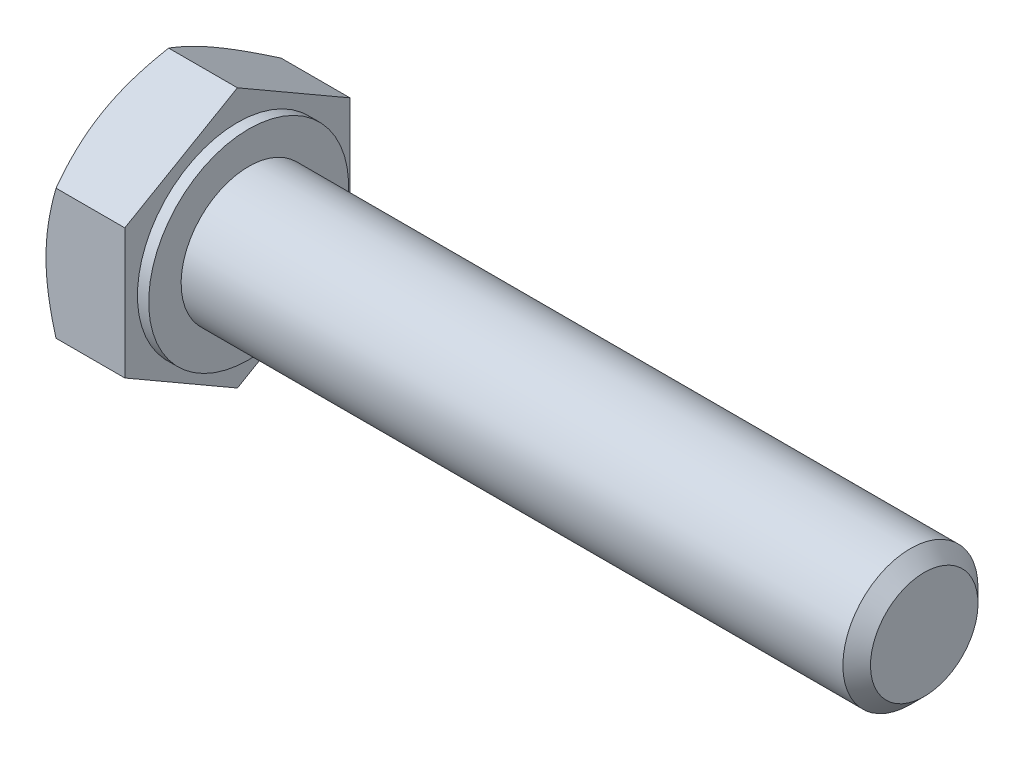
ISO-10303-21;
HEADER;
FILE_DESCRIPTION(('STEP AP214'),'2;1');
FILE_NAME('part.step','',(''),(''),'','','');
FILE_SCHEMA(('AUTOMOTIVE_DESIGN { 1 0 10303 214 1 1 1 1 }'));
ENDSEC;
DATA;
#1=APPLICATION_CONTEXT('core data for automotive mechanical design processes');
#2=APPLICATION_PROTOCOL_DEFINITION('international standard','automotive_design',2000,#1);
#3=PRODUCT_CONTEXT('',#1,'mechanical');
#4=PRODUCT('Part','Part','',(#3));
#5=PRODUCT_RELATED_PRODUCT_CATEGORY('part','',(#4));
#6=PRODUCT_DEFINITION_FORMATION('','',#4);
#7=PRODUCT_DEFINITION_CONTEXT('part definition',#1,'design');
#8=PRODUCT_DEFINITION('design','',#6,#7);
#9=PRODUCT_DEFINITION_SHAPE('','',#8);
#10=(LENGTH_UNIT() NAMED_UNIT(*) SI_UNIT(.MILLI.,.METRE.));
#11=(NAMED_UNIT(*) PLANE_ANGLE_UNIT() SI_UNIT($,.RADIAN.));
#12=(NAMED_UNIT(*) SI_UNIT($,.STERADIAN.) SOLID_ANGLE_UNIT());
#13=UNCERTAINTY_MEASURE_WITH_UNIT(LENGTH_MEASURE(1.E-05),#10,'distance_accuracy_value','');
#14=(GEOMETRIC_REPRESENTATION_CONTEXT(3) GLOBAL_UNCERTAINTY_ASSIGNED_CONTEXT((#13)) GLOBAL_UNIT_ASSIGNED_CONTEXT((#10,
#11,#12)) REPRESENTATION_CONTEXT('',''));
#15=CARTESIAN_POINT('',(0.,0.,0.));
#16=DIRECTION('',(0.,0.,1.));
#17=DIRECTION('',(1.,0.,0.));
#18=AXIS2_PLACEMENT_3D('',#15,#16,#17);
#19=CARTESIAN_POINT('',(0.,3.72,0.));
#20=DIRECTION('',(1.,0.,0.));
#21=DIRECTION('',(0.,1.,0.));
#22=AXIS2_PLACEMENT_3D('',#19,#20,#21);
#23=PLANE('',#22);
#24=CARTESIAN_POINT('',(0.,0.,0.));
#25=DIRECTION('',(1.,0.,0.));
#26=DIRECTION('',(0.,1.,0.));
#27=AXIS2_PLACEMENT_3D('',#24,#25,#26);
#28=CIRCLE('',#27,3.);
#29=CARTESIAN_POINT('',(0.,-3.,0.));
#30=VERTEX_POINT('',#29);
#31=EDGE_CURVE('E21',#30,#30,#28,.T.);
#32=ORIENTED_EDGE('',*,*,#31,.F.);
#33=EDGE_LOOP('',(#32));
#34=FACE_BOUND('',#33,.T.);
#35=CARTESIAN_POINT('',(0.,0.,0.));
#36=DIRECTION('',(1.,0.,0.));
#37=DIRECTION('',(0.,1.,0.));
#38=AXIS2_PLACEMENT_3D('',#35,#36,#37);
#39=CIRCLE('',#38,4.44);
#40=CARTESIAN_POINT('',(0.,-4.44,0.));
#41=VERTEX_POINT('',#40);
#42=EDGE_CURVE('E28',#41,#41,#39,.T.);
#43=ORIENTED_EDGE('',*,*,#42,.T.);
#44=EDGE_LOOP('',(#43));
#45=FACE_BOUND('',#44,.T.);
#46=ADVANCED_FACE('F17',(#34,#45),#23,.T.);
#47=CARTESIAN_POINT('',(-0.250049999999993,0.,0.));
#48=DIRECTION('',(1.,0.,0.));
#49=DIRECTION('',(0.,1.,0.));
#50=AXIS2_PLACEMENT_3D('',#47,#48,#49);
#51=CYLINDRICAL_SURFACE('',#50,4.44);
#52=ORIENTED_EDGE('',*,*,#42,.F.);
#53=DIRECTION('',(-1.,0.,0.));
#54=VECTOR('',#53,1.);
#55=CARTESIAN_POINT('',(-0.250049999999993,-4.44,0.));
#56=LINE('',#55,#54);
#57=CARTESIAN_POINT('',(-0.5001,-4.44,0.));
#58=VERTEX_POINT('',#57);
#59=EDGE_CURVE('E11',#41,#58,#56,.T.);
#60=ORIENTED_EDGE('',*,*,#59,.T.);
#61=CARTESIAN_POINT('',(-0.500099999999994,0.,0.));
#62=DIRECTION('',(1.,0.,0.));
#63=DIRECTION('',(0.,1.,0.));
#64=AXIS2_PLACEMENT_3D('',#61,#62,#63);
#65=CIRCLE('',#64,4.44);
#66=EDGE_CURVE('E213',#58,#58,#65,.T.);
#67=ORIENTED_EDGE('',*,*,#66,.T.);
#68=ORIENTED_EDGE('',*,*,#59,.F.);
#69=EDGE_LOOP('',(#52,#60,#67,#68));
#70=FACE_BOUND('',#69,.T.);
#71=ADVANCED_FACE('F440',(#70),#51,.T.);
#72=CARTESIAN_POINT('',(-4.0001,0.,0.));
#73=DIRECTION('',(1.,0.,0.));
#74=DIRECTION('',(0.,1.,0.));
#75=AXIS2_PLACEMENT_3D('',#72,#73,#74);
#76=PLANE('',#75);
#77=CARTESIAN_POINT('',(-4.0001,0.,0.));
#78=DIRECTION('',(-1.,0.,0.));
#79=DIRECTION('',(0.,1.,0.));
#80=AXIS2_PLACEMENT_3D('',#77,#78,#79);
#81=CIRCLE('',#80,5.);
#82=CARTESIAN_POINT('',(-4.0001,0.,5.));
#83=VERTEX_POINT('',#82);
#84=CARTESIAN_POINT('',(-4.0001,4.33012701892219,2.5));
#85=VERTEX_POINT('',#84);
#86=EDGE_CURVE('E218',#83,#85,#81,.T.);
#87=ORIENTED_EDGE('',*,*,#86,.T.);
#88=CARTESIAN_POINT('',(-4.0001,0.,0.));
#89=DIRECTION('',(-1.,0.,0.));
#90=DIRECTION('',(0.,1.,0.));
#91=AXIS2_PLACEMENT_3D('',#88,#89,#90);
#92=CIRCLE('',#91,5.);
#93=CARTESIAN_POINT('',(-4.0001,4.33012701892219,-2.5));
#94=VERTEX_POINT('',#93);
#95=EDGE_CURVE('E151',#85,#94,#92,.T.);
#96=ORIENTED_EDGE('',*,*,#95,.T.);
#97=CARTESIAN_POINT('',(-4.0001,0.,0.));
#98=DIRECTION('',(-1.,0.,0.));
#99=DIRECTION('',(0.,1.,0.));
#100=AXIS2_PLACEMENT_3D('',#97,#98,#99);
#101=CIRCLE('',#100,5.);
#102=CARTESIAN_POINT('',(-4.0001,0.,-5.));
#103=VERTEX_POINT('',#102);
#104=EDGE_CURVE('E166',#94,#103,#101,.T.);
#105=ORIENTED_EDGE('',*,*,#104,.T.);
#106=CARTESIAN_POINT('',(-4.0001,0.,0.));
#107=DIRECTION('',(-1.,0.,0.));
#108=DIRECTION('',(0.,1.,0.));
#109=AXIS2_PLACEMENT_3D('',#106,#107,#108);
#110=CIRCLE('',#109,5.);
#111=CARTESIAN_POINT('',(-4.0001,-4.33012701892219,-2.5));
#112=VERTEX_POINT('',#111);
#113=EDGE_CURVE('E176',#103,#112,#110,.T.);
#114=ORIENTED_EDGE('',*,*,#113,.T.);
#115=CARTESIAN_POINT('',(-4.0001,0.,0.));
#116=DIRECTION('',(-1.,0.,0.));
#117=DIRECTION('',(0.,1.,0.));
#118=AXIS2_PLACEMENT_3D('',#115,#116,#117);
#119=CIRCLE('',#118,5.);
#120=CARTESIAN_POINT('',(-4.0001,-4.33012701892219,2.5));
#121=VERTEX_POINT('',#120);
#122=EDGE_CURVE('E198',#112,#121,#119,.T.);
#123=ORIENTED_EDGE('',*,*,#122,.T.);
#124=CARTESIAN_POINT('',(-4.0001,0.,0.));
#125=DIRECTION('',(-1.,0.,0.));
#126=DIRECTION('',(0.,1.,0.));
#127=AXIS2_PLACEMENT_3D('',#124,#125,#126);
#128=CIRCLE('',#127,5.);
#129=EDGE_CURVE('E152',#121,#83,#128,.T.);
#130=ORIENTED_EDGE('',*,*,#129,.T.);
#131=EDGE_LOOP('',(#87,#96,#105,#114,#123,#130));
#132=FACE_BOUND('',#131,.T.);
#133=ADVANCED_FACE('F402',(#132),#76,.F.);
#134=CARTESIAN_POINT('',(-0.500099999999993,-5.77350269189625,0.));
#135=DIRECTION('',(0.,-0.866025403784439,-0.5));
#136=DIRECTION('',(0.,0.5,-0.866025403784439));
#137=AXIS2_PLACEMENT_3D('',#134,#135,#136);
#138=PLANE('',#137);
#139=CARTESIAN_POINT('',(-4.0001,-4.33012701892219,-2.5));
#140=CARTESIAN_POINT('',(-4.00010000000001,-3.66025403784439,-3.66025403784438));
#141=CARTESIAN_POINT('',(-3.55351801261482,-2.88675134594814,-5.));
#142=(BOUNDED_CURVE() B_SPLINE_CURVE(2,(#139,#140,#141),.UNSPECIFIED.,.F.,
.F.) B_SPLINE_CURVE_WITH_KNOTS((3,3),(0.292854859387618,0.585709718775236),
.UNSPECIFIED.) CURVE() GEOMETRIC_REPRESENTATION_ITEM() RATIONAL_B_SPLINE_CURVE((1.,
1.03795484930205,1.)) REPRESENTATION_ITEM(''));
#143=CARTESIAN_POINT('',(-3.55351801261482,-2.88675134594814,-5.));
#144=VERTEX_POINT('',#143);
#145=EDGE_CURVE('E167',#112,#144,#142,.T.);
#146=ORIENTED_EDGE('',*,*,#145,.T.);
#147=DIRECTION('',(-1.,0.,0.));
#148=VECTOR('',#147,1.);
#149=CARTESIAN_POINT('',(-0.500099999999993,-2.88675134594812,-5.));
#150=LINE('',#149,#148);
#151=CARTESIAN_POINT('',(-0.500099999999993,-2.88675134594812,-5.));
#152=VERTEX_POINT('',#151);
#153=EDGE_CURVE('E132',#152,#144,#150,.T.);
#154=ORIENTED_EDGE('',*,*,#153,.F.);
#155=DIRECTION('',(0.,0.5,-0.866025403784439));
#156=VECTOR('',#155,1.);
#157=CARTESIAN_POINT('',(-0.500099999999993,-5.77350269189625,0.));
#158=LINE('',#157,#156);
#159=CARTESIAN_POINT('',(-0.500099999999993,-5.77350269189625,0.));
#160=VERTEX_POINT('',#159);
#161=EDGE_CURVE('E217',#160,#152,#158,.T.);
#162=ORIENTED_EDGE('',*,*,#161,.F.);
#163=DIRECTION('',(-1.,0.,0.));
#164=VECTOR('',#163,1.);
#165=CARTESIAN_POINT('',(-0.500099999999993,-5.77350269189625,0.));
#166=LINE('',#165,#164);
#167=CARTESIAN_POINT('',(-3.55351801261482,-5.77350269189624,0.));
#168=VERTEX_POINT('',#167);
#169=EDGE_CURVE('E241',#160,#168,#166,.T.);
#170=ORIENTED_EDGE('',*,*,#169,.T.);
#171=CARTESIAN_POINT('',(-3.55351801261482,-5.77350269189624,0.));
#172=CARTESIAN_POINT('',(-4.00010000000001,-4.99999999999999,-1.33974596215562));
#173=CARTESIAN_POINT('',(-4.0001,-4.33012701892219,-2.5));
#174=(BOUNDED_CURVE() B_SPLINE_CURVE(2,(#171,#172,#173),.UNSPECIFIED.,.F.,
.F.) B_SPLINE_CURVE_WITH_KNOTS((3,3),(0.,0.292854859387618),
.UNSPECIFIED.) CURVE() GEOMETRIC_REPRESENTATION_ITEM() RATIONAL_B_SPLINE_CURVE((1.,
1.03795484930206,1.)) REPRESENTATION_ITEM(''));
#175=EDGE_CURVE('E199',#168,#112,#174,.T.);
#176=ORIENTED_EDGE('',*,*,#175,.T.);
#177=EDGE_LOOP('',(#146,#154,#162,#170,#176));
#178=FACE_BOUND('',#177,.T.);
#179=ADVANCED_FACE('F397',(#178),#138,.T.);
#180=CARTESIAN_POINT('',(-0.500099999999993,-2.88675134594813,5.));
#181=DIRECTION('',(0.,-0.866025403784439,0.5));
#182=DIRECTION('',(-1.,0.,0.));
#183=AXIS2_PLACEMENT_3D('',#180,#181,#182);
#184=PLANE('',#183);
#185=CARTESIAN_POINT('',(-4.0001,-4.33012701892219,2.5));
#186=CARTESIAN_POINT('',(-4.00010000000001,-4.99999999999999,1.33974596215562));
#187=CARTESIAN_POINT('',(-3.55351801261482,-5.77350269189624,0.));
#188=(BOUNDED_CURVE() B_SPLINE_CURVE(2,(#185,#186,#187),.UNSPECIFIED.,.F.,
.F.) B_SPLINE_CURVE_WITH_KNOTS((3,3),(0.292854859387618,0.585709718775236),
.UNSPECIFIED.) CURVE() GEOMETRIC_REPRESENTATION_ITEM() RATIONAL_B_SPLINE_CURVE((1.,
1.03795484930203,1.)) REPRESENTATION_ITEM(''));
#189=EDGE_CURVE('E192',#121,#168,#188,.T.);
#190=ORIENTED_EDGE('',*,*,#189,.T.);
#191=ORIENTED_EDGE('',*,*,#169,.F.);
#192=DIRECTION('',(0.,-0.5,-0.866025403784439));
#193=VECTOR('',#192,1.);
#194=CARTESIAN_POINT('',(-0.500099999999993,-2.88675134594813,5.));
#195=LINE('',#194,#193);
#196=CARTESIAN_POINT('',(-0.500099999999993,-2.88675134594813,5.));
#197=VERTEX_POINT('',#196);
#198=EDGE_CURVE('E260',#197,#160,#195,.T.);
#199=ORIENTED_EDGE('',*,*,#198,.F.);
#200=DIRECTION('',(-1.,0.,0.));
#201=VECTOR('',#200,1.);
#202=CARTESIAN_POINT('',(-0.500099999999993,-2.88675134594813,5.));
#203=LINE('',#202,#201);
#204=CARTESIAN_POINT('',(-3.55351801261482,-2.8867513459481,5.));
#205=VERTEX_POINT('',#204);
#206=EDGE_CURVE('E216',#197,#205,#203,.T.);
#207=ORIENTED_EDGE('',*,*,#206,.T.);
#208=CARTESIAN_POINT('',(-3.55351801261482,-2.88675134594814,5.));
#209=CARTESIAN_POINT('',(-4.00010000000001,-3.66025403784439,3.66025403784437));
#210=CARTESIAN_POINT('',(-4.0001,-4.33012701892219,2.5));
#211=(BOUNDED_CURVE() B_SPLINE_CURVE(2,(#208,#209,#210),.UNSPECIFIED.,.F.,
.F.) B_SPLINE_CURVE_WITH_KNOTS((3,3),(0.,0.292854859387618),
.UNSPECIFIED.) CURVE() GEOMETRIC_REPRESENTATION_ITEM() RATIONAL_B_SPLINE_CURVE((1.,
1.03795484930204,1.)) REPRESENTATION_ITEM(''));
#212=EDGE_CURVE('E208',#205,#121,#211,.T.);
#213=ORIENTED_EDGE('',*,*,#212,.T.);
#214=EDGE_LOOP('',(#190,#191,#199,#207,#213));
#215=FACE_BOUND('',#214,.T.);
#216=ADVANCED_FACE('F377',(#215),#184,.T.);
#217=CARTESIAN_POINT('',(-0.500099999999994,2.88675134594812,5.));
#218=DIRECTION('',(0.,0.,1.));
#219=DIRECTION('',(0.,-1.,0.));
#220=AXIS2_PLACEMENT_3D('',#217,#218,#219);
#221=PLANE('',#220);
#222=CARTESIAN_POINT('',(-4.0001,0.,5.));
#223=CARTESIAN_POINT('',(-4.00010000000001,-1.3397459621556,4.99999999999999));
#224=CARTESIAN_POINT('',(-3.55351801261482,-2.8867513459481,5.));
#225=(BOUNDED_CURVE() B_SPLINE_CURVE(2,(#222,#223,#224),.UNSPECIFIED.,.F.,
.F.) B_SPLINE_CURVE_WITH_KNOTS((3,3),(0.292854859387618,0.585709718775236),
.UNSPECIFIED.) CURVE() GEOMETRIC_REPRESENTATION_ITEM() RATIONAL_B_SPLINE_CURVE((1.,
1.03795484930204,1.)) REPRESENTATION_ITEM(''));
#226=EDGE_CURVE('E200',#83,#205,#225,.T.);
#227=ORIENTED_EDGE('',*,*,#226,.T.);
#228=ORIENTED_EDGE('',*,*,#206,.F.);
#229=DIRECTION('',(0.,-1.,0.));
#230=VECTOR('',#229,1.);
#231=CARTESIAN_POINT('',(-0.500099999999994,2.88675134594812,5.));
#232=LINE('',#231,#230);
#233=CARTESIAN_POINT('',(-0.500099999999994,2.88675134594812,5.));
#234=VERTEX_POINT('',#233);
#235=EDGE_CURVE('E115',#234,#197,#232,.T.);
#236=ORIENTED_EDGE('',*,*,#235,.F.);
#237=DIRECTION('',(-1.,0.,0.));
#238=VECTOR('',#237,1.);
#239=CARTESIAN_POINT('',(-0.500099999999994,2.88675134594812,5.));
#240=LINE('',#239,#238);
#241=CARTESIAN_POINT('',(-3.55351801261482,2.88675134594809,5.));
#242=VERTEX_POINT('',#241);
#243=EDGE_CURVE('E111',#234,#242,#240,.T.);
#244=ORIENTED_EDGE('',*,*,#243,.T.);
#245=CARTESIAN_POINT('',(-3.55351801261482,2.88675134594809,5.));
#246=CARTESIAN_POINT('',(-4.00010000000001,1.33974596215559,5.));
#247=CARTESIAN_POINT('',(-4.0001,0.,5.));
#248=(BOUNDED_CURVE() B_SPLINE_CURVE(2,(#245,#246,#247),.UNSPECIFIED.,.F.,
.F.) B_SPLINE_CURVE_WITH_KNOTS((3,3),(0.,0.292854859387618),
.UNSPECIFIED.) CURVE() GEOMETRIC_REPRESENTATION_ITEM() RATIONAL_B_SPLINE_CURVE((1.,
1.03795484930205,1.)) REPRESENTATION_ITEM(''));
#249=EDGE_CURVE('E222',#242,#83,#248,.T.);
#250=ORIENTED_EDGE('',*,*,#249,.T.);
#251=EDGE_LOOP('',(#227,#228,#236,#244,#250));
#252=FACE_BOUND('',#251,.T.);
#253=ADVANCED_FACE('F19',(#252),#221,.T.);
#254=CARTESIAN_POINT('',(-0.500099999999994,0.,0.));
#255=DIRECTION('',(1.,0.,0.));
#256=DIRECTION('',(0.,1.,0.));
#257=AXIS2_PLACEMENT_3D('',#254,#255,#256);
#258=PLANE('',#257);
#259=ORIENTED_EDGE('',*,*,#66,.F.);
#260=EDGE_LOOP('',(#259));
#261=FACE_BOUND('',#260,.T.);
#262=DIRECTION('',(0.,-0.5,0.866025403784438));
#263=VECTOR('',#262,1.);
#264=CARTESIAN_POINT('',(-0.500099999999994,5.77350269189625,0.));
#265=LINE('',#264,#263);
#266=CARTESIAN_POINT('',(-0.500099999999994,5.77350269189625,0.));
#267=VERTEX_POINT('',#266);
#268=EDGE_CURVE('E103',#267,#234,#265,.T.);
#269=ORIENTED_EDGE('',*,*,#268,.T.);
#270=ORIENTED_EDGE('',*,*,#235,.T.);
#271=ORIENTED_EDGE('',*,*,#198,.T.);
#272=ORIENTED_EDGE('',*,*,#161,.T.);
#273=DIRECTION('',(0.,1.,0.));
#274=VECTOR('',#273,1.);
#275=CARTESIAN_POINT('',(-0.500099999999993,-2.88675134594812,-5.));
#276=LINE('',#275,#274);
#277=CARTESIAN_POINT('',(-0.500099999999994,2.88675134594813,-5.));
#278=VERTEX_POINT('',#277);
#279=EDGE_CURVE('E121',#152,#278,#276,.T.);
#280=ORIENTED_EDGE('',*,*,#279,.T.);
#281=DIRECTION('',(0.,0.5,0.866025403784439));
#282=VECTOR('',#281,1.);
#283=CARTESIAN_POINT('',(-0.500099999999994,2.88675134594813,-5.));
#284=LINE('',#283,#282);
#285=EDGE_CURVE('E118',#278,#267,#284,.T.);
#286=ORIENTED_EDGE('',*,*,#285,.T.);
#287=EDGE_LOOP('',(#269,#270,#271,#272,#280,#286));
#288=FACE_BOUND('',#287,.T.);
#289=ADVANCED_FACE('F119',(#261,#288),#258,.T.);
#290=CARTESIAN_POINT('',(-0.500099999999994,5.77350269189625,0.));
#291=DIRECTION('',(0.,0.866025403784438,0.5));
#292=DIRECTION('',(1.,0.,0.));
#293=AXIS2_PLACEMENT_3D('',#290,#291,#292);
#294=PLANE('',#293);
#295=CARTESIAN_POINT('',(-3.55351801261482,5.77350269189624,0.));
#296=CARTESIAN_POINT('',(-4.00010000000001,4.99999999999999,1.33974596215563));
#297=CARTESIAN_POINT('',(-4.0001,4.33012701892219,2.5));
#298=(BOUNDED_CURVE() B_SPLINE_CURVE(2,(#295,#296,#297),.UNSPECIFIED.,.F.,
.F.) B_SPLINE_CURVE_WITH_KNOTS((3,3),(0.,0.292854859387618),
.UNSPECIFIED.) CURVE() GEOMETRIC_REPRESENTATION_ITEM() RATIONAL_B_SPLINE_CURVE((1.,
1.03795484930203,1.)) REPRESENTATION_ITEM(''));
#299=CARTESIAN_POINT('',(-3.55351801261482,5.77350269189624,0.));
#300=VERTEX_POINT('',#299);
#301=EDGE_CURVE('E159',#300,#85,#298,.T.);
#302=ORIENTED_EDGE('',*,*,#301,.T.);
#303=CARTESIAN_POINT('',(-4.0001,4.33012701892219,2.5));
#304=CARTESIAN_POINT('',(-4.00010000000001,3.66025403784439,3.66025403784437));
#305=CARTESIAN_POINT('',(-3.55351801261482,2.88675134594814,5.));
#306=(BOUNDED_CURVE() B_SPLINE_CURVE(2,(#303,#304,#305),.UNSPECIFIED.,.F.,
.F.) B_SPLINE_CURVE_WITH_KNOTS((3,3),(0.292854859387618,0.585709718775236),
.UNSPECIFIED.) CURVE() GEOMETRIC_REPRESENTATION_ITEM() RATIONAL_B_SPLINE_CURVE((1.,
1.03795484930205,1.)) REPRESENTATION_ITEM(''));
#307=EDGE_CURVE('E223',#85,#242,#306,.T.);
#308=ORIENTED_EDGE('',*,*,#307,.T.);
#309=ORIENTED_EDGE('',*,*,#243,.F.);
#310=ORIENTED_EDGE('',*,*,#268,.F.);
#311=DIRECTION('',(-1.,0.,0.));
#312=VECTOR('',#311,1.);
#313=CARTESIAN_POINT('',(-0.500099999999994,5.77350269189625,0.));
#314=LINE('',#313,#312);
#315=EDGE_CURVE('E108',#267,#300,#314,.T.);
#316=ORIENTED_EDGE('',*,*,#315,.T.);
#317=EDGE_LOOP('',(#302,#308,#309,#310,#316));
#318=FACE_BOUND('',#317,.T.);
#319=ADVANCED_FACE('F106',(#318),#294,.T.);
#320=CARTESIAN_POINT('',(-0.500099999999994,2.88675134594813,-5.));
#321=DIRECTION('',(0.,0.866025403784439,-0.5));
#322=DIRECTION('',(-1.,0.,0.));
#323=AXIS2_PLACEMENT_3D('',#320,#321,#322);
#324=PLANE('',#323);
#325=CARTESIAN_POINT('',(-3.55351801261482,2.88675134594814,-5.));
#326=CARTESIAN_POINT('',(-4.00010000000001,3.66025403784439,-3.66025403784437));
#327=CARTESIAN_POINT('',(-4.0001,4.33012701892219,-2.5));
#328=(BOUNDED_CURVE() B_SPLINE_CURVE(2,(#325,#326,#327),.UNSPECIFIED.,.F.,
.F.) B_SPLINE_CURVE_WITH_KNOTS((3,3),(0.,0.292854859387618),
.UNSPECIFIED.) CURVE() GEOMETRIC_REPRESENTATION_ITEM() RATIONAL_B_SPLINE_CURVE((1.,
1.03795484930203,1.)) REPRESENTATION_ITEM(''));
#329=CARTESIAN_POINT('',(-3.55351801261482,2.8867513459481,-5.));
#330=VERTEX_POINT('',#329);
#331=EDGE_CURVE('E160',#330,#94,#328,.T.);
#332=ORIENTED_EDGE('',*,*,#331,.T.);
#333=CARTESIAN_POINT('',(-4.0001,4.33012701892219,-2.5));
#334=CARTESIAN_POINT('',(-4.00010000000001,4.99999999999999,-1.33974596215562));
#335=CARTESIAN_POINT('',(-3.55351801261482,5.77350269189624,0.));
#336=(BOUNDED_CURVE() B_SPLINE_CURVE(2,(#333,#334,#335),.UNSPECIFIED.,.F.,
.F.) B_SPLINE_CURVE_WITH_KNOTS((3,3),(0.292854859387618,0.585709718775236),
.UNSPECIFIED.) CURVE() GEOMETRIC_REPRESENTATION_ITEM() RATIONAL_B_SPLINE_CURVE((1.,
1.03795484930202,1.)) REPRESENTATION_ITEM(''));
#337=EDGE_CURVE('E130',#94,#300,#336,.T.);
#338=ORIENTED_EDGE('',*,*,#337,.T.);
#339=ORIENTED_EDGE('',*,*,#315,.F.);
#340=ORIENTED_EDGE('',*,*,#285,.F.);
#341=DIRECTION('',(-1.,0.,0.));
#342=VECTOR('',#341,1.);
#343=CARTESIAN_POINT('',(-0.500099999999994,2.88675134594813,-5.));
#344=LINE('',#343,#342);
#345=EDGE_CURVE('E189',#278,#330,#344,.T.);
#346=ORIENTED_EDGE('',*,*,#345,.T.);
#347=EDGE_LOOP('',(#332,#338,#339,#340,#346));
#348=FACE_BOUND('',#347,.T.);
#349=ADVANCED_FACE('F128',(#348),#324,.T.);
#350=CARTESIAN_POINT('',(-0.500099999999993,-2.88675134594812,-5.));
#351=DIRECTION('',(0.,0.,-1.));
#352=DIRECTION('',(-1.,0.,0.));
#353=AXIS2_PLACEMENT_3D('',#350,#351,#352);
#354=PLANE('',#353);
#355=CARTESIAN_POINT('',(-3.55351801261482,-2.88675134594809,-5.));
#356=CARTESIAN_POINT('',(-4.00010000000001,-1.3397459621556,-5.));
#357=CARTESIAN_POINT('',(-4.0001,0.,-5.));
#358=(BOUNDED_CURVE() B_SPLINE_CURVE(2,(#355,#356,#357),.UNSPECIFIED.,.F.,
.F.) B_SPLINE_CURVE_WITH_KNOTS((3,3),(0.,0.292854859387618),
.UNSPECIFIED.) CURVE() GEOMETRIC_REPRESENTATION_ITEM() RATIONAL_B_SPLINE_CURVE((1.,
1.03795484930205,1.)) REPRESENTATION_ITEM(''));
#359=EDGE_CURVE('E165',#144,#103,#358,.T.);
#360=ORIENTED_EDGE('',*,*,#359,.T.);
#361=CARTESIAN_POINT('',(-4.0001,0.,-5.));
#362=CARTESIAN_POINT('',(-4.00010000000001,1.3397459621556,-5.));
#363=CARTESIAN_POINT('',(-3.55351801261482,2.8867513459481,-5.));
#364=(BOUNDED_CURVE() B_SPLINE_CURVE(2,(#361,#362,#363),.UNSPECIFIED.,.F.,
.F.) B_SPLINE_CURVE_WITH_KNOTS((3,3),(0.292854859387618,0.585709718775236),
.UNSPECIFIED.) CURVE() GEOMETRIC_REPRESENTATION_ITEM() RATIONAL_B_SPLINE_CURVE((1.,
1.03795484930204,1.)) REPRESENTATION_ITEM(''));
#365=EDGE_CURVE('E182',#103,#330,#364,.T.);
#366=ORIENTED_EDGE('',*,*,#365,.T.);
#367=ORIENTED_EDGE('',*,*,#345,.F.);
#368=ORIENTED_EDGE('',*,*,#279,.F.);
#369=ORIENTED_EDGE('',*,*,#153,.T.);
#370=EDGE_LOOP('',(#360,#366,#367,#368,#369));
#371=FACE_BOUND('',#370,.T.);
#372=ADVANCED_FACE('F336',(#371),#354,.T.);
#373=CARTESIAN_POINT('',(-3.77680900630741,0.,0.));
#374=DIRECTION('',(1.,0.,0.));
#375=DIRECTION('',(0.,1.,0.));
#376=AXIS2_PLACEMENT_3D('',#373,#374,#375);
#377=CONICAL_SURFACE('',#376,5.38675134594812,1.0471975511966);
#378=ORIENTED_EDGE('',*,*,#359,.F.);
#379=ORIENTED_EDGE('',*,*,#145,.F.);
#380=ORIENTED_EDGE('',*,*,#113,.F.);
#381=EDGE_LOOP('',(#378,#379,#380));
#382=FACE_BOUND('',#381,.T.);
#383=ADVANCED_FACE('F430',(#382),#377,.T.);
#384=CARTESIAN_POINT('',(-3.77680900630741,0.,0.));
#385=DIRECTION('',(1.,0.,0.));
#386=DIRECTION('',(0.,1.,0.));
#387=AXIS2_PLACEMENT_3D('',#384,#385,#386);
#388=CONICAL_SURFACE('',#387,5.38675134594812,1.0471975511966);
#389=ORIENTED_EDGE('',*,*,#365,.F.);
#390=ORIENTED_EDGE('',*,*,#104,.F.);
#391=ORIENTED_EDGE('',*,*,#331,.F.);
#392=EDGE_LOOP('',(#389,#390,#391));
#393=FACE_BOUND('',#392,.T.);
#394=ADVANCED_FACE('F341',(#393),#388,.T.);
#395=CARTESIAN_POINT('',(-3.77680900630741,0.,0.));
#396=DIRECTION('',(1.,0.,0.));
#397=DIRECTION('',(0.,-1.,0.));
#398=AXIS2_PLACEMENT_3D('',#395,#396,#397);
#399=CONICAL_SURFACE('',#398,5.38675134594812,1.0471975511966);
#400=ORIENTED_EDGE('',*,*,#175,.F.);
#401=ORIENTED_EDGE('',*,*,#189,.F.);
#402=ORIENTED_EDGE('',*,*,#122,.F.);
#403=EDGE_LOOP('',(#400,#401,#402));
#404=FACE_BOUND('',#403,.T.);
#405=ADVANCED_FACE('F456',(#404),#399,.T.);
#406=CARTESIAN_POINT('',(-3.77680900630741,0.,0.));
#407=DIRECTION('',(1.,0.,0.));
#408=DIRECTION('',(0.,1.,0.));
#409=AXIS2_PLACEMENT_3D('',#406,#407,#408);
#410=CONICAL_SURFACE('',#409,5.38675134594812,1.0471975511966);
#411=ORIENTED_EDGE('',*,*,#337,.F.);
#412=ORIENTED_EDGE('',*,*,#95,.F.);
#413=ORIENTED_EDGE('',*,*,#301,.F.);
#414=EDGE_LOOP('',(#411,#412,#413));
#415=FACE_BOUND('',#414,.T.);
#416=ADVANCED_FACE('F461',(#415),#410,.T.);
#417=CARTESIAN_POINT('',(-3.77680900630741,0.,0.));
#418=DIRECTION('',(1.,0.,0.));
#419=DIRECTION('',(0.,1.,0.));
#420=AXIS2_PLACEMENT_3D('',#417,#418,#419);
#421=CONICAL_SURFACE('',#420,5.38675134594812,1.0471975511966);
#422=ORIENTED_EDGE('',*,*,#212,.F.);
#423=ORIENTED_EDGE('',*,*,#226,.F.);
#424=ORIENTED_EDGE('',*,*,#129,.F.);
#425=EDGE_LOOP('',(#422,#423,#424));
#426=FACE_BOUND('',#425,.T.);
#427=ADVANCED_FACE('F472',(#426),#421,.T.);
#428=CARTESIAN_POINT('',(-3.77680900630741,0.,0.));
#429=DIRECTION('',(1.,0.,0.));
#430=DIRECTION('',(0.,1.,0.));
#431=AXIS2_PLACEMENT_3D('',#428,#429,#430);
#432=CONICAL_SURFACE('',#431,5.38675134594812,1.0471975511966);
#433=ORIENTED_EDGE('',*,*,#307,.F.);
#434=ORIENTED_EDGE('',*,*,#86,.F.);
#435=ORIENTED_EDGE('',*,*,#249,.F.);
#436=EDGE_LOOP('',(#433,#434,#435));
#437=FACE_BOUND('',#436,.T.);
#438=ADVANCED_FACE('F284',(#437),#432,.T.);
#439=CARTESIAN_POINT('',(30.,1.5,0.));
#440=DIRECTION('',(1.,0.,0.));
#441=DIRECTION('',(0.,1.,0.));
#442=AXIS2_PLACEMENT_3D('',#439,#440,#441);
#443=PLANE('',#442);
#444=CARTESIAN_POINT('',(30.,0.,0.));
#445=DIRECTION('',(-1.,0.,0.));
#446=DIRECTION('',(0.,-1.,0.));
#447=AXIS2_PLACEMENT_3D('',#444,#445,#446);
#448=CIRCLE('',#447,2.38655);
#449=CARTESIAN_POINT('',(30.,2.38655,0.));
#450=VERTEX_POINT('',#449);
#451=EDGE_CURVE('E142',#450,#450,#448,.T.);
#452=ORIENTED_EDGE('',*,*,#451,.F.);
#453=EDGE_LOOP('',(#452));
#454=FACE_BOUND('',#453,.T.);
#455=ADVANCED_FACE('F471',(#454),#443,.T.);
#456=CARTESIAN_POINT('',(16.5,0.,0.));
#457=DIRECTION('',(1.,0.,0.));
#458=DIRECTION('',(0.,1.,0.));
#459=AXIS2_PLACEMENT_3D('',#456,#457,#458);
#460=CYLINDRICAL_SURFACE('',#459,3.);
#461=CARTESIAN_POINT('',(29.38645,0.,0.));
#462=DIRECTION('',(1.,0.,0.));
#463=DIRECTION('',(0.,-1.,0.));
#464=AXIS2_PLACEMENT_3D('',#461,#462,#463);
#465=CIRCLE('',#464,3.);
#466=CARTESIAN_POINT('',(29.38645,3.,0.));
#467=VERTEX_POINT('',#466);
#468=CARTESIAN_POINT('',(29.38645,-3.,0.));
#469=VERTEX_POINT('',#468);
#470=EDGE_CURVE('E272',#467,#469,#465,.T.);
#471=ORIENTED_EDGE('',*,*,#470,.F.);
#472=CARTESIAN_POINT('',(29.38645,0.,0.));
#473=DIRECTION('',(1.,0.,0.));
#474=DIRECTION('',(0.,-1.,0.));
#475=AXIS2_PLACEMENT_3D('',#472,#473,#474);
#476=CIRCLE('',#475,3.);
#477=EDGE_CURVE('E188',#469,#467,#476,.T.);
#478=ORIENTED_EDGE('',*,*,#477,.F.);
#479=DIRECTION('',(-1.,0.,0.));
#480=VECTOR('',#479,1.);
#481=CARTESIAN_POINT('',(16.5,-3.,0.));
#482=LINE('',#481,#480);
#483=EDGE_CURVE('E184',#469,#30,#482,.T.);
#484=ORIENTED_EDGE('',*,*,#483,.T.);
#485=ORIENTED_EDGE('',*,*,#31,.T.);
#486=ORIENTED_EDGE('',*,*,#483,.F.);
#487=EDGE_LOOP('',(#471,#478,#484,#485,#486));
#488=FACE_BOUND('',#487,.T.);
#489=ADVANCED_FACE('F418',(#488),#460,.T.);
#490=CARTESIAN_POINT('',(29.693225,0.,0.));
#491=DIRECTION('',(-1.,0.,0.));
#492=DIRECTION('',(0.,-1.,0.));
#493=AXIS2_PLACEMENT_3D('',#490,#491,#492);
#494=CONICAL_SURFACE('',#493,2.693275,0.785316663805127);
#495=ORIENTED_EDGE('',*,*,#451,.T.);
#496=DIRECTION('',(-0.707164407752512,0.70704914992385,0.));
#497=VECTOR('',#496,1.);
#498=CARTESIAN_POINT('',(29.693225,2.693275,0.));
#499=LINE('',#498,#497);
#500=EDGE_CURVE('E146',#450,#467,#499,.T.);
#501=ORIENTED_EDGE('',*,*,#500,.T.);
#502=ORIENTED_EDGE('',*,*,#470,.T.);
#503=ORIENTED_EDGE('',*,*,#477,.T.);
#504=ORIENTED_EDGE('',*,*,#500,.F.);
#505=EDGE_LOOP('',(#495,#501,#502,#503,#504));
#506=FACE_BOUND('',#505,.T.);
#507=ADVANCED_FACE('F413',(#506),#494,.T.);
#508=CLOSED_SHELL('',(#46,#71,#133,#179,#216,#253,#289,#319,#349,#372,#383,#394,#405,#416,#427,
#438,#455,#489,#507));
#509=MANIFOLD_SOLID_BREP('B1',#508);
#510=ADVANCED_BREP_SHAPE_REPRESENTATION('',(#18,#509),#14);
#511=SHAPE_DEFINITION_REPRESENTATION(#9,#510);
ENDSEC;
END-ISO-10303-21;
